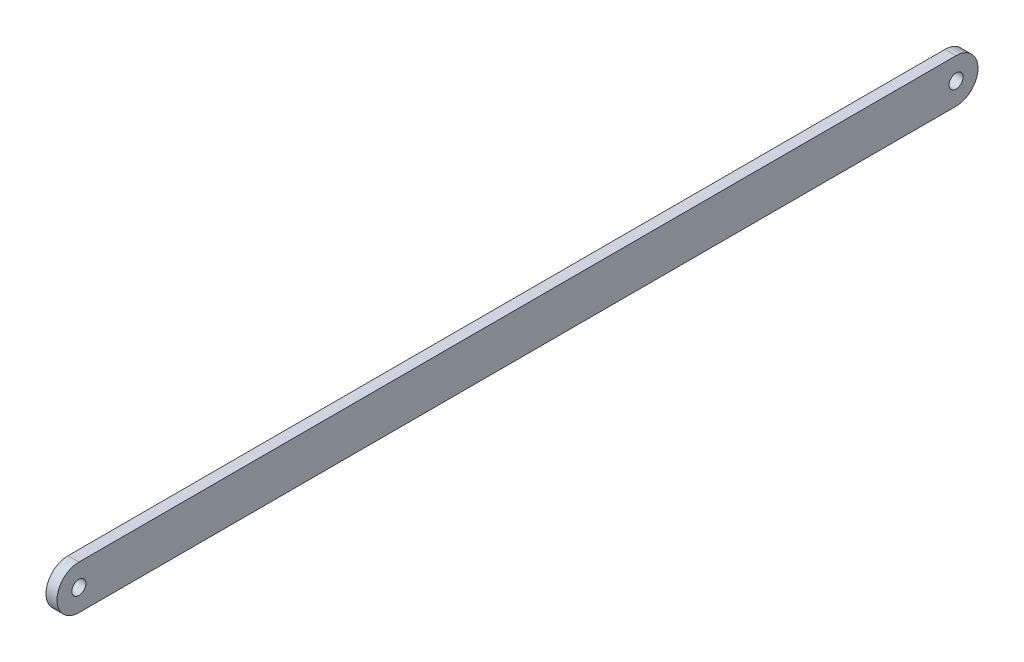
ISO-10303-21;
HEADER;
FILE_DESCRIPTION(('STEP AP214'),'2;1');
FILE_NAME('part.step','',(''),(''),'','','');
FILE_SCHEMA(('AUTOMOTIVE_DESIGN { 1 0 10303 214 1 1 1 1 }'));
ENDSEC;
DATA;
#1=APPLICATION_CONTEXT('core data for automotive mechanical design processes');
#2=APPLICATION_PROTOCOL_DEFINITION('international standard','automotive_design',2000,#1);
#3=PRODUCT_CONTEXT('',#1,'mechanical');
#4=PRODUCT('Part','Part','',(#3));
#5=PRODUCT_RELATED_PRODUCT_CATEGORY('part','',(#4));
#6=PRODUCT_DEFINITION_FORMATION('','',#4);
#7=PRODUCT_DEFINITION_CONTEXT('part definition',#1,'design');
#8=PRODUCT_DEFINITION('design','',#6,#7);
#9=PRODUCT_DEFINITION_SHAPE('','',#8);
#10=(LENGTH_UNIT() NAMED_UNIT(*) SI_UNIT(.MILLI.,.METRE.));
#11=(NAMED_UNIT(*) PLANE_ANGLE_UNIT() SI_UNIT($,.RADIAN.));
#12=(NAMED_UNIT(*) SI_UNIT($,.STERADIAN.) SOLID_ANGLE_UNIT());
#13=UNCERTAINTY_MEASURE_WITH_UNIT(LENGTH_MEASURE(1.E-05),#10,'distance_accuracy_value','');
#14=(GEOMETRIC_REPRESENTATION_CONTEXT(3) GLOBAL_UNCERTAINTY_ASSIGNED_CONTEXT((#13)) GLOBAL_UNIT_ASSIGNED_CONTEXT((#10,
#11,#12)) REPRESENTATION_CONTEXT('',''));
#15=CARTESIAN_POINT('',(0.,0.,0.));
#16=DIRECTION('',(0.,0.,1.));
#17=DIRECTION('',(1.,0.,0.));
#18=AXIS2_PLACEMENT_3D('',#15,#16,#17);
#19=CARTESIAN_POINT('',(3.175,0.,0.));
#20=DIRECTION('',(1.,0.,0.));
#21=DIRECTION('',(0.,0.,-1.));
#22=AXIS2_PLACEMENT_3D('',#19,#20,#21);
#23=PLANE('',#22);
#24=CARTESIAN_POINT('',(3.175,0.,254.));
#25=DIRECTION('',(1.,0.,0.));
#26=DIRECTION('',(0.,0.,-1.));
#27=AXIS2_PLACEMENT_3D('',#24,#25,#26);
#28=CIRCLE('',#27,2.03199999999995);
#29=CARTESIAN_POINT('',(3.175,0.,251.968));
#30=VERTEX_POINT('',#29);
#31=EDGE_CURVE('E106',#30,#30,#28,.T.);
#32=ORIENTED_EDGE('',*,*,#31,.F.);
#33=EDGE_LOOP('',(#32));
#34=FACE_BOUND('',#33,.T.);
#35=CARTESIAN_POINT('',(3.175,0.,0.));
#36=DIRECTION('',(1.,0.,0.));
#37=DIRECTION('',(0.,0.,-1.));
#38=AXIS2_PLACEMENT_3D('',#35,#36,#37);
#39=CIRCLE('',#38,6.35);
#40=CARTESIAN_POINT('',(3.175,-6.35,0.));
#41=VERTEX_POINT('',#40);
#42=CARTESIAN_POINT('',(3.175,6.35,0.));
#43=VERTEX_POINT('',#42);
#44=EDGE_CURVE('E91',#41,#43,#39,.T.);
#45=ORIENTED_EDGE('',*,*,#44,.T.);
#46=DIRECTION('',(0.,0.,1.));
#47=VECTOR('',#46,1.);
#48=CARTESIAN_POINT('',(3.175,6.35,0.));
#49=LINE('',#48,#47);
#50=CARTESIAN_POINT('',(3.175,6.35,254.));
#51=VERTEX_POINT('',#50);
#52=EDGE_CURVE('E86',#43,#51,#49,.T.);
#53=ORIENTED_EDGE('',*,*,#52,.T.);
#54=CARTESIAN_POINT('',(3.175,0.,254.));
#55=DIRECTION('',(1.,0.,0.));
#56=DIRECTION('',(0.,0.,-1.));
#57=AXIS2_PLACEMENT_3D('',#54,#55,#56);
#58=CIRCLE('',#57,6.35);
#59=CARTESIAN_POINT('',(3.175,-6.35000000000003,254.));
#60=VERTEX_POINT('',#59);
#61=EDGE_CURVE('E89',#51,#60,#58,.T.);
#62=ORIENTED_EDGE('',*,*,#61,.T.);
#63=DIRECTION('',(0.,0.,-1.));
#64=VECTOR('',#63,1.);
#65=CARTESIAN_POINT('',(3.175,-6.35,0.));
#66=LINE('',#65,#64);
#67=EDGE_CURVE('E56',#60,#41,#66,.T.);
#68=ORIENTED_EDGE('',*,*,#67,.T.);
#69=EDGE_LOOP('',(#45,#53,#62,#68));
#70=FACE_BOUND('',#69,.T.);
#71=CARTESIAN_POINT('',(3.175,0.,0.));
#72=DIRECTION('',(1.,0.,0.));
#73=DIRECTION('',(0.,0.,-1.));
#74=AXIS2_PLACEMENT_3D('',#71,#72,#73);
#75=CIRCLE('',#74,2.032);
#76=CARTESIAN_POINT('',(3.175,0.,-2.032));
#77=VERTEX_POINT('',#76);
#78=EDGE_CURVE('E121',#77,#77,#75,.T.);
#79=ORIENTED_EDGE('',*,*,#78,.F.);
#80=EDGE_LOOP('',(#79));
#81=FACE_BOUND('',#80,.T.);
#82=ADVANCED_FACE('F39',(#34,#70,#81),#23,.T.);
#83=CARTESIAN_POINT('',(0.,0.,0.));
#84=DIRECTION('',(1.,0.,0.));
#85=DIRECTION('',(0.,0.,-1.));
#86=AXIS2_PLACEMENT_3D('',#83,#84,#85);
#87=PLANE('',#86);
#88=CARTESIAN_POINT('',(0.,0.,0.));
#89=DIRECTION('',(1.,0.,0.));
#90=DIRECTION('',(0.,0.,-1.));
#91=AXIS2_PLACEMENT_3D('',#88,#89,#90);
#92=CIRCLE('',#91,6.35);
#93=CARTESIAN_POINT('',(0.,-6.35,0.));
#94=VERTEX_POINT('',#93);
#95=CARTESIAN_POINT('',(0.,6.35,0.));
#96=VERTEX_POINT('',#95);
#97=EDGE_CURVE('E103',#94,#96,#92,.T.);
#98=ORIENTED_EDGE('',*,*,#97,.F.);
#99=DIRECTION('',(0.,0.,-1.));
#100=VECTOR('',#99,1.);
#101=CARTESIAN_POINT('',(0.,-6.35,0.));
#102=LINE('',#101,#100);
#103=CARTESIAN_POINT('',(0.,-6.35000000000003,254.));
#104=VERTEX_POINT('',#103);
#105=EDGE_CURVE('E79',#104,#94,#102,.T.);
#106=ORIENTED_EDGE('',*,*,#105,.F.);
#107=CARTESIAN_POINT('',(0.,0.,254.));
#108=DIRECTION('',(1.,0.,0.));
#109=DIRECTION('',(0.,0.,-1.));
#110=AXIS2_PLACEMENT_3D('',#107,#108,#109);
#111=CIRCLE('',#110,6.35);
#112=CARTESIAN_POINT('',(0.,6.35,254.));
#113=VERTEX_POINT('',#112);
#114=EDGE_CURVE('E73',#113,#104,#111,.T.);
#115=ORIENTED_EDGE('',*,*,#114,.F.);
#116=DIRECTION('',(0.,0.,1.));
#117=VECTOR('',#116,1.);
#118=CARTESIAN_POINT('',(0.,6.35,0.));
#119=LINE('',#118,#117);
#120=EDGE_CURVE('E95',#96,#113,#119,.T.);
#121=ORIENTED_EDGE('',*,*,#120,.F.);
#122=EDGE_LOOP('',(#98,#106,#115,#121));
#123=FACE_BOUND('',#122,.T.);
#124=CARTESIAN_POINT('',(0.,0.,254.));
#125=DIRECTION('',(1.,0.,0.));
#126=DIRECTION('',(0.,0.,-1.));
#127=AXIS2_PLACEMENT_3D('',#124,#125,#126);
#128=CIRCLE('',#127,2.03199999999995);
#129=CARTESIAN_POINT('',(0.,0.,251.968));
#130=VERTEX_POINT('',#129);
#131=EDGE_CURVE('E118',#130,#130,#128,.T.);
#132=ORIENTED_EDGE('',*,*,#131,.T.);
#133=EDGE_LOOP('',(#132));
#134=FACE_BOUND('',#133,.T.);
#135=CARTESIAN_POINT('',(0.,0.,0.));
#136=DIRECTION('',(1.,0.,0.));
#137=DIRECTION('',(0.,0.,-1.));
#138=AXIS2_PLACEMENT_3D('',#135,#136,#137);
#139=CIRCLE('',#138,2.032);
#140=CARTESIAN_POINT('',(0.,0.,-2.032));
#141=VERTEX_POINT('',#140);
#142=EDGE_CURVE('E124',#141,#141,#139,.T.);
#143=ORIENTED_EDGE('',*,*,#142,.T.);
#144=EDGE_LOOP('',(#143));
#145=FACE_BOUND('',#144,.T.);
#146=ADVANCED_FACE('F114',(#123,#134,#145),#87,.F.);
#147=CARTESIAN_POINT('',(3.175,0.,0.));
#148=DIRECTION('',(-1.,0.,0.));
#149=DIRECTION('',(0.,0.,1.));
#150=AXIS2_PLACEMENT_3D('',#147,#148,#149);
#151=CYLINDRICAL_SURFACE('',#150,6.35);
#152=ORIENTED_EDGE('',*,*,#97,.T.);
#153=DIRECTION('',(-1.,0.,0.));
#154=VECTOR('',#153,1.);
#155=CARTESIAN_POINT('',(3.175,6.35,0.));
#156=LINE('',#155,#154);
#157=EDGE_CURVE('E11',#43,#96,#156,.T.);
#158=ORIENTED_EDGE('',*,*,#157,.F.);
#159=ORIENTED_EDGE('',*,*,#44,.F.);
#160=DIRECTION('',(-1.,0.,0.));
#161=VECTOR('',#160,1.);
#162=CARTESIAN_POINT('',(3.175,-6.35,0.));
#163=LINE('',#162,#161);
#164=EDGE_CURVE('E99',#41,#94,#163,.T.);
#165=ORIENTED_EDGE('',*,*,#164,.T.);
#166=EDGE_LOOP('',(#152,#158,#159,#165));
#167=FACE_BOUND('',#166,.T.);
#168=ADVANCED_FACE('F41',(#167),#151,.T.);
#169=CARTESIAN_POINT('',(3.175,6.35,0.));
#170=DIRECTION('',(0.,-1.,0.));
#171=DIRECTION('',(0.,0.,-1.));
#172=AXIS2_PLACEMENT_3D('',#169,#170,#171);
#173=PLANE('',#172);
#174=ORIENTED_EDGE('',*,*,#120,.T.);
#175=DIRECTION('',(-1.,0.,0.));
#176=VECTOR('',#175,1.);
#177=CARTESIAN_POINT('',(3.175,6.35,254.));
#178=LINE('',#177,#176);
#179=EDGE_CURVE('E48',#51,#113,#178,.T.);
#180=ORIENTED_EDGE('',*,*,#179,.F.);
#181=ORIENTED_EDGE('',*,*,#52,.F.);
#182=ORIENTED_EDGE('',*,*,#157,.T.);
#183=EDGE_LOOP('',(#174,#180,#181,#182));
#184=FACE_BOUND('',#183,.T.);
#185=ADVANCED_FACE('F94',(#184),#173,.F.);
#186=CARTESIAN_POINT('',(3.175,0.,254.));
#187=DIRECTION('',(-1.,0.,0.));
#188=DIRECTION('',(0.,0.,1.));
#189=AXIS2_PLACEMENT_3D('',#186,#187,#188);
#190=CYLINDRICAL_SURFACE('',#189,6.35);
#191=ORIENTED_EDGE('',*,*,#114,.T.);
#192=DIRECTION('',(-1.,0.,0.));
#193=VECTOR('',#192,1.);
#194=CARTESIAN_POINT('',(3.175,-6.35000000000003,254.));
#195=LINE('',#194,#193);
#196=EDGE_CURVE('E96',#60,#104,#195,.T.);
#197=ORIENTED_EDGE('',*,*,#196,.F.);
#198=ORIENTED_EDGE('',*,*,#61,.F.);
#199=ORIENTED_EDGE('',*,*,#179,.T.);
#200=EDGE_LOOP('',(#191,#197,#198,#199));
#201=FACE_BOUND('',#200,.T.);
#202=ADVANCED_FACE('F97',(#201),#190,.T.);
#203=CARTESIAN_POINT('',(3.175,-6.35,0.));
#204=DIRECTION('',(0.,1.,0.));
#205=DIRECTION('',(0.,0.,1.));
#206=AXIS2_PLACEMENT_3D('',#203,#204,#205);
#207=PLANE('',#206);
#208=ORIENTED_EDGE('',*,*,#105,.T.);
#209=ORIENTED_EDGE('',*,*,#164,.F.);
#210=ORIENTED_EDGE('',*,*,#67,.F.);
#211=ORIENTED_EDGE('',*,*,#196,.T.);
#212=EDGE_LOOP('',(#208,#209,#210,#211));
#213=FACE_BOUND('',#212,.T.);
#214=ADVANCED_FACE('F111',(#213),#207,.F.);
#215=CARTESIAN_POINT('',(3.175,0.,254.));
#216=DIRECTION('',(-1.,0.,0.));
#217=DIRECTION('',(0.,0.,1.));
#218=AXIS2_PLACEMENT_3D('',#215,#216,#217);
#219=CYLINDRICAL_SURFACE('',#218,2.03199999999995);
#220=ORIENTED_EDGE('',*,*,#31,.T.);
#221=EDGE_LOOP('',(#220));
#222=FACE_BOUND('',#221,.T.);
#223=ORIENTED_EDGE('',*,*,#131,.F.);
#224=EDGE_LOOP('',(#223));
#225=FACE_BOUND('',#224,.T.);
#226=ADVANCED_FACE('F141',(#222,#225),#219,.F.);
#227=CARTESIAN_POINT('',(3.175,0.,0.));
#228=DIRECTION('',(-1.,0.,0.));
#229=DIRECTION('',(0.,0.,1.));
#230=AXIS2_PLACEMENT_3D('',#227,#228,#229);
#231=CYLINDRICAL_SURFACE('',#230,2.032);
#232=ORIENTED_EDGE('',*,*,#78,.T.);
#233=EDGE_LOOP('',(#232));
#234=FACE_BOUND('',#233,.T.);
#235=ORIENTED_EDGE('',*,*,#142,.F.);
#236=EDGE_LOOP('',(#235));
#237=FACE_BOUND('',#236,.T.);
#238=ADVANCED_FACE('F130',(#234,#237),#231,.F.);
#239=CLOSED_SHELL('',(#82,#146,#168,#185,#202,#214,#226,#238));
#240=MANIFOLD_SOLID_BREP('B2',#239);
#241=ADVANCED_BREP_SHAPE_REPRESENTATION('',(#18,#240),#14);
#242=SHAPE_DEFINITION_REPRESENTATION(#9,#241);
ENDSEC;
END-ISO-10303-21;
